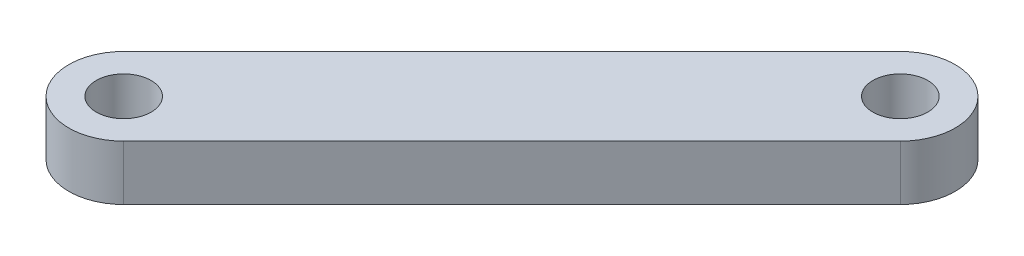
ISO-10303-21;
HEADER;
FILE_DESCRIPTION(('STEP AP214'),'2;1');
FILE_NAME('part.step','',(''),(''),'','','');
FILE_SCHEMA(('AUTOMOTIVE_DESIGN { 1 0 10303 214 1 1 1 1 }'));
ENDSEC;
DATA;
#1=APPLICATION_CONTEXT('core data for automotive mechanical design processes');
#2=APPLICATION_PROTOCOL_DEFINITION('international standard','automotive_design',2000,#1);
#3=PRODUCT_CONTEXT('',#1,'mechanical');
#4=PRODUCT('Part','Part','',(#3));
#5=PRODUCT_RELATED_PRODUCT_CATEGORY('part','',(#4));
#6=PRODUCT_DEFINITION_FORMATION('','',#4);
#7=PRODUCT_DEFINITION_CONTEXT('part definition',#1,'design');
#8=PRODUCT_DEFINITION('design','',#6,#7);
#9=PRODUCT_DEFINITION_SHAPE('','',#8);
#10=(LENGTH_UNIT() NAMED_UNIT(*) SI_UNIT(.MILLI.,.METRE.));
#11=(NAMED_UNIT(*) PLANE_ANGLE_UNIT() SI_UNIT($,.RADIAN.));
#12=(NAMED_UNIT(*) SI_UNIT($,.STERADIAN.) SOLID_ANGLE_UNIT());
#13=UNCERTAINTY_MEASURE_WITH_UNIT(LENGTH_MEASURE(1.E-05),#10,'distance_accuracy_value','');
#14=(GEOMETRIC_REPRESENTATION_CONTEXT(3) GLOBAL_UNCERTAINTY_ASSIGNED_CONTEXT((#13)) GLOBAL_UNIT_ASSIGNED_CONTEXT((#10,
#11,#12)) REPRESENTATION_CONTEXT('',''));
#15=CARTESIAN_POINT('',(0.,0.,0.));
#16=DIRECTION('',(0.,0.,1.));
#17=DIRECTION('',(1.,0.,0.));
#18=AXIS2_PLACEMENT_3D('',#15,#16,#17);
#19=CARTESIAN_POINT('',(0.,10.,0.));
#20=DIRECTION('',(0.,1.,0.));
#21=DIRECTION('',(0.,0.,1.));
#22=AXIS2_PLACEMENT_3D('',#19,#20,#21);
#23=PLANE('',#22);
#24=CARTESIAN_POINT('',(0.,10.,0.));
#25=DIRECTION('',(0.,1.,0.));
#26=DIRECTION('',(0.,0.,1.));
#27=AXIS2_PLACEMENT_3D('',#24,#25,#26);
#28=CIRCLE('',#27,5.);
#29=CARTESIAN_POINT('',(0.,10.,5.));
#30=VERTEX_POINT('',#29);
#31=EDGE_CURVE('E101',#30,#30,#28,.T.);
#32=ORIENTED_EDGE('',*,*,#31,.F.);
#33=EDGE_LOOP('',(#32));
#34=FACE_BOUND('',#33,.T.);
#35=CARTESIAN_POINT('',(0.,10.,0.));
#36=DIRECTION('',(0.,1.,0.));
#37=DIRECTION('',(0.,0.,1.));
#38=AXIS2_PLACEMENT_3D('',#35,#36,#37);
#39=CIRCLE('',#38,10.);
#40=CARTESIAN_POINT('',(-7.07106781186554,10.,-7.07106781186541));
#41=VERTEX_POINT('',#40);
#42=CARTESIAN_POINT('',(7.07106781186554,10.,7.07106781186541));
#43=VERTEX_POINT('',#42);
#44=EDGE_CURVE('E86',#41,#43,#39,.T.);
#45=ORIENTED_EDGE('',*,*,#44,.T.);
#46=DIRECTION('',(0.707106781186541,0.,-0.707106781186554));
#47=VECTOR('',#46,1.);
#48=CARTESIAN_POINT('',(77.7817459305197,10.,-63.63961030679));
#49=LINE('',#48,#47);
#50=CARTESIAN_POINT('',(77.7817459305197,10.,-63.63961030679));
#51=VERTEX_POINT('',#50);
#52=EDGE_CURVE('E81',#43,#51,#49,.T.);
#53=ORIENTED_EDGE('',*,*,#52,.T.);
#54=CARTESIAN_POINT('',(70.7106781186541,10.,-70.7106781186554));
#55=DIRECTION('',(0.,1.,0.));
#56=DIRECTION('',(0.,0.,1.));
#57=AXIS2_PLACEMENT_3D('',#54,#55,#56);
#58=CIRCLE('',#57,10.);
#59=CARTESIAN_POINT('',(63.6396103067886,10.,-77.7817459305208));
#60=VERTEX_POINT('',#59);
#61=EDGE_CURVE('E84',#51,#60,#58,.T.);
#62=ORIENTED_EDGE('',*,*,#61,.T.);
#63=DIRECTION('',(-0.707106781186541,0.,0.707106781186554));
#64=VECTOR('',#63,1.);
#65=CARTESIAN_POINT('',(-7.07106781186554,10.,-7.07106781186541));
#66=LINE('',#65,#64);
#67=EDGE_CURVE('E51',#60,#41,#66,.T.);
#68=ORIENTED_EDGE('',*,*,#67,.T.);
#69=EDGE_LOOP('',(#45,#53,#62,#68));
#70=FACE_BOUND('',#69,.T.);
#71=CARTESIAN_POINT('',(70.7106781186541,10.,-70.7106781186554));
#72=DIRECTION('',(0.,1.,0.));
#73=DIRECTION('',(0.,0.,1.));
#74=AXIS2_PLACEMENT_3D('',#71,#72,#73);
#75=CIRCLE('',#74,4.99999999999999);
#76=CARTESIAN_POINT('',(70.7106781186541,10.,-65.7106781186554));
#77=VERTEX_POINT('',#76);
#78=EDGE_CURVE('E116',#77,#77,#75,.T.);
#79=ORIENTED_EDGE('',*,*,#78,.F.);
#80=EDGE_LOOP('',(#79));
#81=FACE_BOUND('',#80,.T.);
#82=ADVANCED_FACE('F34',(#34,#70,#81),#23,.T.);
#83=CARTESIAN_POINT('',(0.,0.,0.));
#84=DIRECTION('',(0.,1.,0.));
#85=DIRECTION('',(0.,0.,1.));
#86=AXIS2_PLACEMENT_3D('',#83,#84,#85);
#87=PLANE('',#86);
#88=CARTESIAN_POINT('',(0.,0.,0.));
#89=DIRECTION('',(0.,1.,0.));
#90=DIRECTION('',(0.,0.,1.));
#91=AXIS2_PLACEMENT_3D('',#88,#89,#90);
#92=CIRCLE('',#91,10.);
#93=CARTESIAN_POINT('',(-7.07106781186554,0.,-7.07106781186541));
#94=VERTEX_POINT('',#93);
#95=CARTESIAN_POINT('',(7.07106781186554,0.,7.07106781186541));
#96=VERTEX_POINT('',#95);
#97=EDGE_CURVE('E98',#94,#96,#92,.T.);
#98=ORIENTED_EDGE('',*,*,#97,.F.);
#99=DIRECTION('',(-0.707106781186541,0.,0.707106781186554));
#100=VECTOR('',#99,1.);
#101=CARTESIAN_POINT('',(-7.07106781186554,0.,-7.07106781186541));
#102=LINE('',#101,#100);
#103=CARTESIAN_POINT('',(63.6396103067886,0.,-77.7817459305208));
#104=VERTEX_POINT('',#103);
#105=EDGE_CURVE('E74',#104,#94,#102,.T.);
#106=ORIENTED_EDGE('',*,*,#105,.F.);
#107=CARTESIAN_POINT('',(70.7106781186541,0.,-70.7106781186554));
#108=DIRECTION('',(0.,1.,0.));
#109=DIRECTION('',(0.,0.,1.));
#110=AXIS2_PLACEMENT_3D('',#107,#108,#109);
#111=CIRCLE('',#110,10.);
#112=CARTESIAN_POINT('',(77.7817459305197,0.,-63.63961030679));
#113=VERTEX_POINT('',#112);
#114=EDGE_CURVE('E68',#113,#104,#111,.T.);
#115=ORIENTED_EDGE('',*,*,#114,.F.);
#116=DIRECTION('',(0.707106781186541,0.,-0.707106781186554));
#117=VECTOR('',#116,1.);
#118=CARTESIAN_POINT('',(77.7817459305197,0.,-63.63961030679));
#119=LINE('',#118,#117);
#120=EDGE_CURVE('E90',#96,#113,#119,.T.);
#121=ORIENTED_EDGE('',*,*,#120,.F.);
#122=EDGE_LOOP('',(#98,#106,#115,#121));
#123=FACE_BOUND('',#122,.T.);
#124=CARTESIAN_POINT('',(0.,0.,0.));
#125=DIRECTION('',(0.,1.,0.));
#126=DIRECTION('',(0.,0.,1.));
#127=AXIS2_PLACEMENT_3D('',#124,#125,#126);
#128=CIRCLE('',#127,5.);
#129=CARTESIAN_POINT('',(0.,0.,5.));
#130=VERTEX_POINT('',#129);
#131=EDGE_CURVE('E113',#130,#130,#128,.T.);
#132=ORIENTED_EDGE('',*,*,#131,.T.);
#133=EDGE_LOOP('',(#132));
#134=FACE_BOUND('',#133,.T.);
#135=CARTESIAN_POINT('',(70.7106781186541,0.,-70.7106781186554));
#136=DIRECTION('',(0.,1.,0.));
#137=DIRECTION('',(0.,0.,1.));
#138=AXIS2_PLACEMENT_3D('',#135,#136,#137);
#139=CIRCLE('',#138,4.99999999999999);
#140=CARTESIAN_POINT('',(70.7106781186541,0.,-65.7106781186554));
#141=VERTEX_POINT('',#140);
#142=EDGE_CURVE('E119',#141,#141,#139,.T.);
#143=ORIENTED_EDGE('',*,*,#142,.T.);
#144=EDGE_LOOP('',(#143));
#145=FACE_BOUND('',#144,.T.);
#146=ADVANCED_FACE('F109',(#123,#134,#145),#87,.F.);
#147=CARTESIAN_POINT('',(0.,10.,0.));
#148=DIRECTION('',(0.,-1.,0.));
#149=DIRECTION('',(0.,0.,-1.));
#150=AXIS2_PLACEMENT_3D('',#147,#148,#149);
#151=CYLINDRICAL_SURFACE('',#150,10.);
#152=ORIENTED_EDGE('',*,*,#97,.T.);
#153=DIRECTION('',(0.,-1.,0.));
#154=VECTOR('',#153,1.);
#155=CARTESIAN_POINT('',(7.07106781186554,10.,7.07106781186541));
#156=LINE('',#155,#154);
#157=EDGE_CURVE('E11',#43,#96,#156,.T.);
#158=ORIENTED_EDGE('',*,*,#157,.F.);
#159=ORIENTED_EDGE('',*,*,#44,.F.);
#160=DIRECTION('',(0.,-1.,0.));
#161=VECTOR('',#160,1.);
#162=CARTESIAN_POINT('',(-7.07106781186554,10.,-7.07106781186541));
#163=LINE('',#162,#161);
#164=EDGE_CURVE('E94',#41,#94,#163,.T.);
#165=ORIENTED_EDGE('',*,*,#164,.T.);
#166=EDGE_LOOP('',(#152,#158,#159,#165));
#167=FACE_BOUND('',#166,.T.);
#168=ADVANCED_FACE('F36',(#167),#151,.T.);
#169=CARTESIAN_POINT('',(77.7817459305197,10.,-63.63961030679));
#170=DIRECTION('',(-0.707106781186554,0.,-0.707106781186541));
#171=DIRECTION('',(-0.707106781186541,0.,0.707106781186554));
#172=AXIS2_PLACEMENT_3D('',#169,#170,#171);
#173=PLANE('',#172);
#174=ORIENTED_EDGE('',*,*,#120,.T.);
#175=DIRECTION('',(0.,-1.,0.));
#176=VECTOR('',#175,1.);
#177=CARTESIAN_POINT('',(77.7817459305197,10.,-63.63961030679));
#178=LINE('',#177,#176);
#179=EDGE_CURVE('E43',#51,#113,#178,.T.);
#180=ORIENTED_EDGE('',*,*,#179,.F.);
#181=ORIENTED_EDGE('',*,*,#52,.F.);
#182=ORIENTED_EDGE('',*,*,#157,.T.);
#183=EDGE_LOOP('',(#174,#180,#181,#182));
#184=FACE_BOUND('',#183,.T.);
#185=ADVANCED_FACE('F89',(#184),#173,.F.);
#186=CARTESIAN_POINT('',(70.7106781186541,10.,-70.7106781186554));
#187=DIRECTION('',(0.,-1.,0.));
#188=DIRECTION('',(0.,0.,-1.));
#189=AXIS2_PLACEMENT_3D('',#186,#187,#188);
#190=CYLINDRICAL_SURFACE('',#189,10.);
#191=ORIENTED_EDGE('',*,*,#114,.T.);
#192=DIRECTION('',(0.,-1.,0.));
#193=VECTOR('',#192,1.);
#194=CARTESIAN_POINT('',(63.6396103067886,10.,-77.7817459305208));
#195=LINE('',#194,#193);
#196=EDGE_CURVE('E91',#60,#104,#195,.T.);
#197=ORIENTED_EDGE('',*,*,#196,.F.);
#198=ORIENTED_EDGE('',*,*,#61,.F.);
#199=ORIENTED_EDGE('',*,*,#179,.T.);
#200=EDGE_LOOP('',(#191,#197,#198,#199));
#201=FACE_BOUND('',#200,.T.);
#202=ADVANCED_FACE('F92',(#201),#190,.T.);
#203=CARTESIAN_POINT('',(-7.07106781186554,10.,-7.07106781186541));
#204=DIRECTION('',(0.707106781186554,0.,0.707106781186541));
#205=DIRECTION('',(0.707106781186541,0.,-0.707106781186554));
#206=AXIS2_PLACEMENT_3D('',#203,#204,#205);
#207=PLANE('',#206);
#208=ORIENTED_EDGE('',*,*,#105,.T.);
#209=ORIENTED_EDGE('',*,*,#164,.F.);
#210=ORIENTED_EDGE('',*,*,#67,.F.);
#211=ORIENTED_EDGE('',*,*,#196,.T.);
#212=EDGE_LOOP('',(#208,#209,#210,#211));
#213=FACE_BOUND('',#212,.T.);
#214=ADVANCED_FACE('F106',(#213),#207,.F.);
#215=CARTESIAN_POINT('',(0.,10.,0.));
#216=DIRECTION('',(0.,-1.,0.));
#217=DIRECTION('',(0.,0.,-1.));
#218=AXIS2_PLACEMENT_3D('',#215,#216,#217);
#219=CYLINDRICAL_SURFACE('',#218,5.);
#220=ORIENTED_EDGE('',*,*,#31,.T.);
#221=EDGE_LOOP('',(#220));
#222=FACE_BOUND('',#221,.T.);
#223=ORIENTED_EDGE('',*,*,#131,.F.);
#224=EDGE_LOOP('',(#223));
#225=FACE_BOUND('',#224,.T.);
#226=ADVANCED_FACE('F136',(#222,#225),#219,.F.);
#227=CARTESIAN_POINT('',(70.7106781186541,10.,-70.7106781186554));
#228=DIRECTION('',(0.,-1.,0.));
#229=DIRECTION('',(0.,0.,-1.));
#230=AXIS2_PLACEMENT_3D('',#227,#228,#229);
#231=CYLINDRICAL_SURFACE('',#230,4.99999999999999);
#232=ORIENTED_EDGE('',*,*,#78,.T.);
#233=EDGE_LOOP('',(#232));
#234=FACE_BOUND('',#233,.T.);
#235=ORIENTED_EDGE('',*,*,#142,.F.);
#236=EDGE_LOOP('',(#235));
#237=FACE_BOUND('',#236,.T.);
#238=ADVANCED_FACE('F125',(#234,#237),#231,.F.);
#239=CLOSED_SHELL('',(#82,#146,#168,#185,#202,#214,#226,#238));
#240=MANIFOLD_SOLID_BREP('B2',#239);
#241=ADVANCED_BREP_SHAPE_REPRESENTATION('',(#18,#240),#14);
#242=SHAPE_DEFINITION_REPRESENTATION(#9,#241);
ENDSEC;
END-ISO-10303-21;
